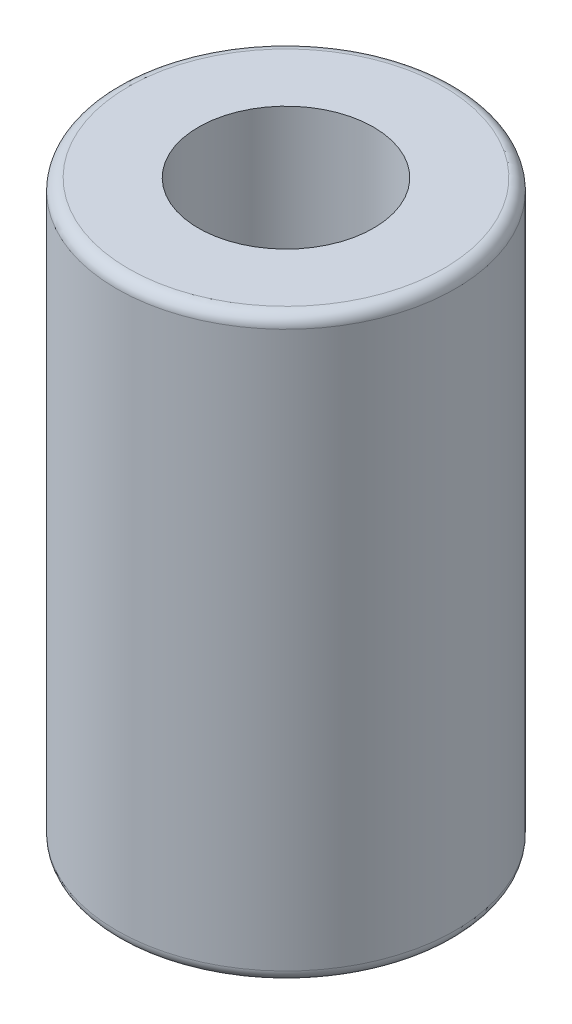
ISO-10303-21;
HEADER;
FILE_DESCRIPTION(('STEP AP214'),'2;1');
FILE_NAME('part.step','',(''),(''),'','','');
FILE_SCHEMA(('AUTOMOTIVE_DESIGN { 1 0 10303 214 1 1 1 1 }'));
ENDSEC;
DATA;
#1=APPLICATION_CONTEXT('core data for automotive mechanical design processes');
#2=APPLICATION_PROTOCOL_DEFINITION('international standard','automotive_design',2000,#1);
#3=PRODUCT_CONTEXT('',#1,'mechanical');
#4=PRODUCT('Part','Part','',(#3));
#5=PRODUCT_RELATED_PRODUCT_CATEGORY('part','',(#4));
#6=PRODUCT_DEFINITION_FORMATION('','',#4);
#7=PRODUCT_DEFINITION_CONTEXT('part definition',#1,'design');
#8=PRODUCT_DEFINITION('design','',#6,#7);
#9=PRODUCT_DEFINITION_SHAPE('','',#8);
#10=(LENGTH_UNIT() NAMED_UNIT(*) SI_UNIT(.MILLI.,.METRE.));
#11=(NAMED_UNIT(*) PLANE_ANGLE_UNIT() SI_UNIT($,.RADIAN.));
#12=(NAMED_UNIT(*) SI_UNIT($,.STERADIAN.) SOLID_ANGLE_UNIT());
#13=UNCERTAINTY_MEASURE_WITH_UNIT(LENGTH_MEASURE(1.E-05),#10,'distance_accuracy_value','');
#14=(GEOMETRIC_REPRESENTATION_CONTEXT(3) GLOBAL_UNCERTAINTY_ASSIGNED_CONTEXT((#13)) GLOBAL_UNIT_ASSIGNED_CONTEXT((#10,
#11,#12)) REPRESENTATION_CONTEXT('',''));
#15=CARTESIAN_POINT('',(0.,0.,0.));
#16=DIRECTION('',(0.,0.,1.));
#17=DIRECTION('',(1.,0.,0.));
#18=AXIS2_PLACEMENT_3D('',#15,#16,#17);
#19=CARTESIAN_POINT('',(0.,24.8,0.));
#20=DIRECTION('',(0.,1.,0.));
#21=DIRECTION('',(0.,0.,1.));
#22=AXIS2_PLACEMENT_3D('',#19,#20,#21);
#23=PLANE('',#22);
#24=CARTESIAN_POINT('',(0.,24.8,0.));
#25=DIRECTION('',(0.,1.,0.));
#26=DIRECTION('',(0.,0.,1.));
#27=AXIS2_PLACEMENT_3D('',#24,#25,#26);
#28=CIRCLE('',#27,6.75);
#29=CARTESIAN_POINT('',(0.,24.8,6.75));
#30=VERTEX_POINT('',#29);
#31=EDGE_CURVE('E10',#30,#30,#28,.T.);
#32=ORIENTED_EDGE('',*,*,#31,.T.);
#33=EDGE_LOOP('',(#32));
#34=FACE_BOUND('',#33,.T.);
#35=CARTESIAN_POINT('',(0.,24.8,0.));
#36=DIRECTION('',(0.,1.,0.));
#37=DIRECTION('',(0.,0.,1.));
#38=AXIS2_PLACEMENT_3D('',#35,#36,#37);
#39=CIRCLE('',#38,3.75);
#40=CARTESIAN_POINT('',(0.,24.8,-3.75));
#41=VERTEX_POINT('',#40);
#42=EDGE_CURVE('E51',#41,#41,#39,.T.);
#43=ORIENTED_EDGE('',*,*,#42,.F.);
#44=EDGE_LOOP('',(#43));
#45=FACE_BOUND('',#44,.T.);
#46=ADVANCED_FACE('F31',(#34,#45),#23,.T.);
#47=CARTESIAN_POINT('',(0.,0.,0.));
#48=DIRECTION('',(0.,1.,0.));
#49=DIRECTION('',(0.,0.,1.));
#50=AXIS2_PLACEMENT_3D('',#47,#48,#49);
#51=PLANE('',#50);
#52=CARTESIAN_POINT('',(0.,0.,0.));
#53=DIRECTION('',(0.,1.,0.));
#54=DIRECTION('',(0.,0.,1.));
#55=AXIS2_PLACEMENT_3D('',#52,#53,#54);
#56=CIRCLE('',#55,6.75);
#57=CARTESIAN_POINT('',(0.,0.,6.75));
#58=VERTEX_POINT('',#57);
#59=EDGE_CURVE('E38',#58,#58,#56,.F.);
#60=ORIENTED_EDGE('',*,*,#59,.T.);
#61=EDGE_LOOP('',(#60));
#62=FACE_BOUND('',#61,.T.);
#63=CARTESIAN_POINT('',(0.,0.,0.));
#64=DIRECTION('',(0.,1.,0.));
#65=DIRECTION('',(0.,0.,1.));
#66=AXIS2_PLACEMENT_3D('',#63,#64,#65);
#67=CIRCLE('',#66,3.75);
#68=CARTESIAN_POINT('',(0.,0.,-3.75));
#69=VERTEX_POINT('',#68);
#70=EDGE_CURVE('E52',#69,#69,#67,.T.);
#71=ORIENTED_EDGE('',*,*,#70,.T.);
#72=EDGE_LOOP('',(#71));
#73=FACE_BOUND('',#72,.T.);
#74=ADVANCED_FACE('F62',(#62,#73),#51,.F.);
#75=CARTESIAN_POINT('',(0.,24.8,0.));
#76=DIRECTION('',(0.,-1.,0.));
#77=DIRECTION('',(0.,0.,-1.));
#78=AXIS2_PLACEMENT_3D('',#75,#76,#77);
#79=CYLINDRICAL_SURFACE('',#78,7.25);
#80=CARTESIAN_POINT('',(0.,0.5,0.));
#81=DIRECTION('',(0.,1.,0.));
#82=DIRECTION('',(0.,0.,1.));
#83=AXIS2_PLACEMENT_3D('',#80,#81,#82);
#84=CIRCLE('',#83,7.25);
#85=CARTESIAN_POINT('',(0.,0.5,-7.25));
#86=VERTEX_POINT('',#85);
#87=EDGE_CURVE('E42',#86,#86,#84,.T.);
#88=CARTESIAN_POINT('',(0.,24.3,0.));
#89=DIRECTION('',(0.,1.,0.));
#90=DIRECTION('',(0.,0.,1.));
#91=AXIS2_PLACEMENT_3D('',#88,#89,#90);
#92=CIRCLE('',#91,7.25);
#93=CARTESIAN_POINT('',(0.,24.3,-7.25));
#94=VERTEX_POINT('',#93);
#95=EDGE_CURVE('E46',#94,#94,#92,.F.);
#96=CARTESIAN_POINT('',(0.,0.5,-7.25));
#97=CARTESIAN_POINT('',(0.,0.747916666666667,-7.25));
#98=CARTESIAN_POINT('',(0.,0.995833333333335,-7.25));
#99=CARTESIAN_POINT('',(0.,1.49166666666667,-7.25));
#100=CARTESIAN_POINT('',(0.,1.73958333333333,-7.25));
#101=CARTESIAN_POINT('',(0.,2.23541666666667,-7.25));
#102=CARTESIAN_POINT('',(0.,2.48333333333333,-7.25));
#103=CARTESIAN_POINT('',(0.,2.97916666666667,-7.25));
#104=CARTESIAN_POINT('',(0.,3.22708333333333,-7.25));
#105=CARTESIAN_POINT('',(0.,3.72291666666667,-7.25));
#106=CARTESIAN_POINT('',(0.,3.97083333333333,-7.25));
#107=CARTESIAN_POINT('',(0.,4.46666666666667,-7.25));
#108=CARTESIAN_POINT('',(0.,4.71458333333333,-7.25));
#109=CARTESIAN_POINT('',(0.,5.21041666666667,-7.25));
#110=CARTESIAN_POINT('',(0.,5.45833333333334,-7.25));
#111=CARTESIAN_POINT('',(0.,5.95416666666667,-7.25));
#112=CARTESIAN_POINT('',(0.,6.20208333333333,-7.25));
#113=CARTESIAN_POINT('',(0.,6.69791666666667,-7.25));
#114=CARTESIAN_POINT('',(0.,6.94583333333333,-7.25));
#115=CARTESIAN_POINT('',(0.,7.44166666666667,-7.25));
#116=CARTESIAN_POINT('',(0.,7.68958333333333,-7.25));
#117=CARTESIAN_POINT('',(0.,8.18541666666667,-7.25));
#118=CARTESIAN_POINT('',(0.,8.43333333333333,-7.25));
#119=CARTESIAN_POINT('',(0.,8.92916666666667,-7.25));
#120=CARTESIAN_POINT('',(0.,9.17708333333333,-7.25));
#121=CARTESIAN_POINT('',(0.,9.67291666666667,-7.25));
#122=CARTESIAN_POINT('',(0.,9.92083333333333,-7.25));
#123=CARTESIAN_POINT('',(0.,10.4166666666667,-7.25));
#124=CARTESIAN_POINT('',(0.,10.6645833333333,-7.25));
#125=CARTESIAN_POINT('',(0.,11.1604166666667,-7.25));
#126=CARTESIAN_POINT('',(0.,11.4083333333333,-7.25));
#127=CARTESIAN_POINT('',(0.,11.9041666666667,-7.25));
#128=CARTESIAN_POINT('',(0.,12.1520833333333,-7.25));
#129=CARTESIAN_POINT('',(0.,12.6479166666667,-7.25));
#130=CARTESIAN_POINT('',(0.,12.8958333333333,-7.25));
#131=CARTESIAN_POINT('',(0.,13.3916666666667,-7.25));
#132=CARTESIAN_POINT('',(0.,13.6395833333333,-7.25));
#133=CARTESIAN_POINT('',(0.,14.1354166666667,-7.25));
#134=CARTESIAN_POINT('',(0.,14.3833333333333,-7.25));
#135=CARTESIAN_POINT('',(0.,14.8791666666667,-7.25));
#136=CARTESIAN_POINT('',(0.,15.1270833333333,-7.25));
#137=CARTESIAN_POINT('',(0.,15.6229166666667,-7.25));
#138=CARTESIAN_POINT('',(0.,15.8708333333333,-7.25));
#139=CARTESIAN_POINT('',(0.,16.3666666666667,-7.25));
#140=CARTESIAN_POINT('',(0.,16.6145833333333,-7.25));
#141=CARTESIAN_POINT('',(0.,17.1104166666667,-7.25));
#142=CARTESIAN_POINT('',(0.,17.3583333333333,-7.25));
#143=CARTESIAN_POINT('',(0.,17.8541666666667,-7.25));
#144=CARTESIAN_POINT('',(0.,18.1020833333333,-7.25));
#145=CARTESIAN_POINT('',(0.,18.5979166666667,-7.25));
#146=CARTESIAN_POINT('',(0.,18.8458333333333,-7.25));
#147=CARTESIAN_POINT('',(0.,19.3416666666667,-7.25));
#148=CARTESIAN_POINT('',(0.,19.5895833333333,-7.25));
#149=CARTESIAN_POINT('',(0.,20.0854166666667,-7.25));
#150=CARTESIAN_POINT('',(0.,20.3333333333333,-7.25));
#151=CARTESIAN_POINT('',(0.,20.8291666666667,-7.25));
#152=CARTESIAN_POINT('',(0.,21.0770833333333,-7.25));
#153=CARTESIAN_POINT('',(0.,21.5729166666667,-7.25));
#154=CARTESIAN_POINT('',(0.,21.8208333333333,-7.25));
#155=CARTESIAN_POINT('',(0.,22.3166666666667,-7.25));
#156=CARTESIAN_POINT('',(0.,22.5645833333333,-7.25));
#157=CARTESIAN_POINT('',(0.,23.0604166666667,-7.25));
#158=CARTESIAN_POINT('',(0.,23.3083333333333,-7.25));
#159=CARTESIAN_POINT('',(0.,23.8041666666667,-7.25));
#160=CARTESIAN_POINT('',(0.,24.0520833333333,-7.25));
#161=CARTESIAN_POINT('',(0.,24.3,-7.25));
#162=B_SPLINE_CURVE_WITH_KNOTS('',3,(#96,#97,#98,#99,#100,#101,#102,#103,#104,#105,#106,#107,
#108,#109,#110,#111,#112,#113,#114,#115,#116,#117,#118,#119,#120,#121,#122,#123,#124,#125,#126,
#127,#128,#129,#130,#131,#132,#133,#134,#135,#136,#137,#138,#139,#140,#141,#142,#143,#144,#145,
#146,#147,#148,#149,#150,#151,#152,#153,#154,#155,#156,#157,#158,#159,#160,#161),.UNSPECIFIED.,
.F.,.F.,(4,2,2,2,2,2,2,2,2,2,2,2,2,2,2,2,2,2,2,2,2,2,2,2,2,2,2,2,2,2,2,2,4),(0.,
0.743750000000001,1.4875,2.23125,2.975,3.71875,4.4625,5.20625,5.95,6.69375,7.4375,8.18125,8.925,
9.66875,10.4125,11.15625,11.9,12.64375,13.3875,14.13125,14.875,15.61875,16.3625,17.10625,17.85,
18.59375,19.3375,20.08125,20.825,21.56875,22.3125,23.05625,23.8),.UNSPECIFIED.);
#163=EDGE_CURVE('BSEAM67',#86,#94,#162,.T.);
#164=ORIENTED_EDGE('',*,*,#87,.T.);
#165=ORIENTED_EDGE('',*,*,#95,.T.);
#166=ORIENTED_EDGE('',*,*,#163,.T.);
#167=ORIENTED_EDGE('',*,*,#163,.F.);
#168=EDGE_LOOP('',(#164,#166,#165,#167));
#169=FACE_BOUND('',#168,.T.);
#170=ADVANCED_FACE('F67',(#169),#79,.T.);
#171=CARTESIAN_POINT('',(0.,24.8,0.));
#172=DIRECTION('',(0.,-1.,0.));
#173=DIRECTION('',(0.,0.,-1.));
#174=AXIS2_PLACEMENT_3D('',#171,#172,#173);
#175=CYLINDRICAL_SURFACE('',#174,3.75);
#176=CARTESIAN_POINT('',(0.,24.8,-3.75));
#177=CARTESIAN_POINT('',(0.,24.5416666666667,-3.75));
#178=CARTESIAN_POINT('',(0.,24.2833333333333,-3.75));
#179=CARTESIAN_POINT('',(0.,23.7666666666667,-3.75));
#180=CARTESIAN_POINT('',(0.,23.5083333333333,-3.75));
#181=CARTESIAN_POINT('',(0.,22.9916666666667,-3.75));
#182=CARTESIAN_POINT('',(0.,22.7333333333333,-3.75));
#183=CARTESIAN_POINT('',(0.,22.2166666666667,-3.75));
#184=CARTESIAN_POINT('',(0.,21.9583333333333,-3.75));
#185=CARTESIAN_POINT('',(0.,21.4416666666667,-3.75));
#186=CARTESIAN_POINT('',(0.,21.1833333333333,-3.75));
#187=CARTESIAN_POINT('',(0.,20.6666666666667,-3.75));
#188=CARTESIAN_POINT('',(0.,20.4083333333333,-3.75));
#189=CARTESIAN_POINT('',(0.,19.8916666666667,-3.75));
#190=CARTESIAN_POINT('',(0.,19.6333333333333,-3.75));
#191=CARTESIAN_POINT('',(0.,19.1166666666667,-3.75));
#192=CARTESIAN_POINT('',(0.,18.8583333333333,-3.75));
#193=CARTESIAN_POINT('',(0.,18.3416666666667,-3.75));
#194=CARTESIAN_POINT('',(0.,18.0833333333333,-3.75));
#195=CARTESIAN_POINT('',(0.,17.5666666666667,-3.75));
#196=CARTESIAN_POINT('',(0.,17.3083333333333,-3.75));
#197=CARTESIAN_POINT('',(0.,16.7916666666667,-3.75));
#198=CARTESIAN_POINT('',(0.,16.5333333333333,-3.75));
#199=CARTESIAN_POINT('',(0.,16.0166666666667,-3.75));
#200=CARTESIAN_POINT('',(0.,15.7583333333333,-3.75));
#201=CARTESIAN_POINT('',(0.,15.2416666666667,-3.75));
#202=CARTESIAN_POINT('',(0.,14.9833333333333,-3.75));
#203=CARTESIAN_POINT('',(0.,14.4666666666667,-3.75));
#204=CARTESIAN_POINT('',(0.,14.2083333333333,-3.75));
#205=CARTESIAN_POINT('',(0.,13.6916666666667,-3.75));
#206=CARTESIAN_POINT('',(0.,13.4333333333333,-3.75));
#207=CARTESIAN_POINT('',(0.,12.9166666666667,-3.75));
#208=CARTESIAN_POINT('',(0.,12.6583333333333,-3.75));
#209=CARTESIAN_POINT('',(0.,12.1416666666667,-3.75));
#210=CARTESIAN_POINT('',(0.,11.8833333333333,-3.75));
#211=CARTESIAN_POINT('',(0.,11.3666666666667,-3.75));
#212=CARTESIAN_POINT('',(0.,11.1083333333333,-3.75));
#213=CARTESIAN_POINT('',(0.,10.5916666666667,-3.75));
#214=CARTESIAN_POINT('',(0.,10.3333333333333,-3.75));
#215=CARTESIAN_POINT('',(0.,9.81666666666667,-3.75));
#216=CARTESIAN_POINT('',(0.,9.55833333333333,-3.75));
#217=CARTESIAN_POINT('',(0.,9.04166666666667,-3.75));
#218=CARTESIAN_POINT('',(0.,8.78333333333333,-3.75));
#219=CARTESIAN_POINT('',(0.,8.26666666666667,-3.75));
#220=CARTESIAN_POINT('',(0.,8.00833333333333,-3.75));
#221=CARTESIAN_POINT('',(0.,7.49166666666667,-3.75));
#222=CARTESIAN_POINT('',(0.,7.23333333333333,-3.75));
#223=CARTESIAN_POINT('',(0.,6.71666666666667,-3.75));
#224=CARTESIAN_POINT('',(0.,6.45833333333333,-3.75));
#225=CARTESIAN_POINT('',(0.,5.94166666666667,-3.75));
#226=CARTESIAN_POINT('',(0.,5.68333333333333,-3.75));
#227=CARTESIAN_POINT('',(0.,5.16666666666667,-3.75));
#228=CARTESIAN_POINT('',(0.,4.90833333333333,-3.75));
#229=CARTESIAN_POINT('',(0.,4.39166666666667,-3.75));
#230=CARTESIAN_POINT('',(0.,4.13333333333333,-3.75));
#231=CARTESIAN_POINT('',(0.,3.61666666666667,-3.75));
#232=CARTESIAN_POINT('',(0.,3.35833333333333,-3.75));
#233=CARTESIAN_POINT('',(0.,2.84166666666667,-3.75));
#234=CARTESIAN_POINT('',(0.,2.58333333333333,-3.75));
#235=CARTESIAN_POINT('',(0.,2.06666666666667,-3.75));
#236=CARTESIAN_POINT('',(0.,1.80833333333333,-3.75));
#237=CARTESIAN_POINT('',(0.,1.29166666666667,-3.75));
#238=CARTESIAN_POINT('',(0.,1.03333333333333,-3.75));
#239=CARTESIAN_POINT('',(0.,0.516666666666668,-3.75));
#240=CARTESIAN_POINT('',(0.,0.258333333333334,-3.75));
#241=CARTESIAN_POINT('',(0.,0.,-3.75));
#242=B_SPLINE_CURVE_WITH_KNOTS('',3,(#176,#177,#178,#179,#180,#181,#182,#183,#184,#185,#186,
#187,#188,#189,#190,#191,#192,#193,#194,#195,#196,#197,#198,#199,#200,#201,#202,#203,#204,#205,
#206,#207,#208,#209,#210,#211,#212,#213,#214,#215,#216,#217,#218,#219,#220,#221,#222,#223,#224,
#225,#226,#227,#228,#229,#230,#231,#232,#233,#234,#235,#236,#237,#238,#239,#240,#241),
.UNSPECIFIED.,.F.,.F.,(4,2,2,2,2,2,2,2,2,2,2,2,2,2,2,2,2,2,2,2,2,2,2,2,2,2,2,2,2,2,2,2,4),(0.,
0.774999999999998,1.55,2.325,3.1,3.875,4.65,5.425,6.2,6.975,7.75,8.525,9.3,10.075,10.85,11.625,
12.4,13.175,13.95,14.725,15.5,16.275,17.05,17.825,18.6,19.375,20.15,20.925,21.7,22.475,23.25,
24.025,24.8),.UNSPECIFIED.);
#243=EDGE_CURVE('BSEAM58',#41,#69,#242,.T.);
#244=ORIENTED_EDGE('',*,*,#42,.T.);
#245=ORIENTED_EDGE('',*,*,#70,.F.);
#246=ORIENTED_EDGE('',*,*,#243,.T.);
#247=ORIENTED_EDGE('',*,*,#243,.F.);
#248=EDGE_LOOP('',(#244,#246,#245,#247));
#249=FACE_BOUND('',#248,.T.);
#250=ADVANCED_FACE('F58',(#249),#175,.F.);
#251=CARTESIAN_POINT('',(0.,0.5,0.));
#252=DIRECTION('',(0.,1.,0.));
#253=DIRECTION('',(0.,0.,1.));
#254=AXIS2_PLACEMENT_3D('',#251,#252,#253);
#255=TOROIDAL_SURFACE('',#254,6.75,0.5);
#256=ORIENTED_EDGE('',*,*,#59,.F.);
#257=EDGE_LOOP('',(#256));
#258=FACE_BOUND('',#257,.T.);
#259=ORIENTED_EDGE('',*,*,#87,.F.);
#260=EDGE_LOOP('',(#259));
#261=FACE_BOUND('',#260,.T.);
#262=ADVANCED_FACE('F73',(#258,#261),#255,.T.);
#263=CARTESIAN_POINT('',(0.,24.3,0.));
#264=DIRECTION('',(0.,1.,0.));
#265=DIRECTION('',(0.,0.,1.));
#266=AXIS2_PLACEMENT_3D('',#263,#264,#265);
#267=TOROIDAL_SURFACE('',#266,6.75,0.5);
#268=ORIENTED_EDGE('',*,*,#95,.F.);
#269=EDGE_LOOP('',(#268));
#270=FACE_BOUND('',#269,.T.);
#271=ORIENTED_EDGE('',*,*,#31,.F.);
#272=EDGE_LOOP('',(#271));
#273=FACE_BOUND('',#272,.T.);
#274=ADVANCED_FACE('F33',(#270,#273),#267,.T.);
#275=CLOSED_SHELL('',(#46,#74,#170,#250,#262,#274));
#276=MANIFOLD_SOLID_BREP('B2',#275);
#277=ADVANCED_BREP_SHAPE_REPRESENTATION('',(#18,#276),#14);
#278=SHAPE_DEFINITION_REPRESENTATION(#9,#277);
ENDSEC;
END-ISO-10303-21;
